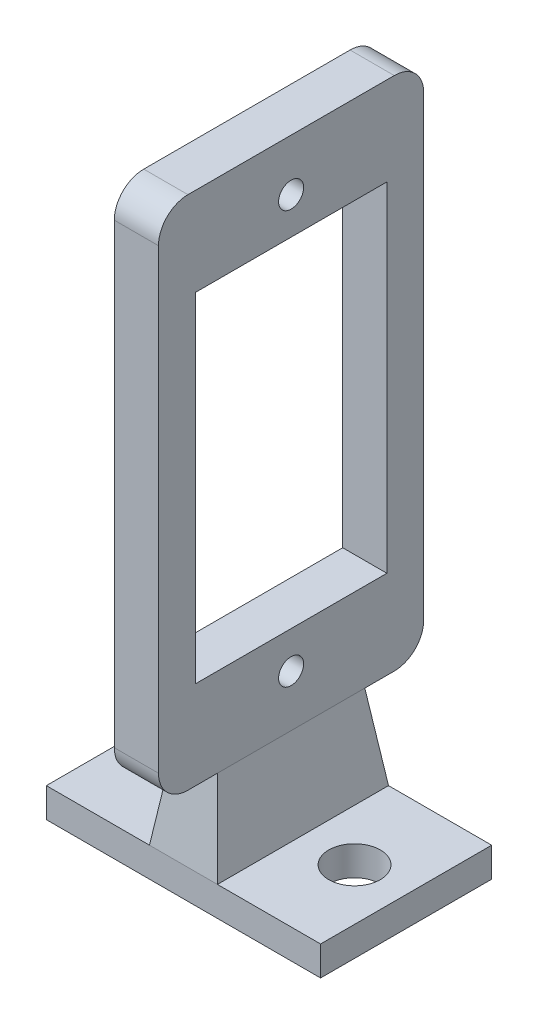
ISO-10303-21;
HEADER;
FILE_DESCRIPTION(('STEP AP214'),'2;1');
FILE_NAME('part.step','',(''),(''),'','','');
FILE_SCHEMA(('AUTOMOTIVE_DESIGN { 1 0 10303 214 1 1 1 1 }'));
ENDSEC;
DATA;
#1=APPLICATION_CONTEXT('core data for automotive mechanical design processes');
#2=APPLICATION_PROTOCOL_DEFINITION('international standard','automotive_design',2000,#1);
#3=PRODUCT_CONTEXT('',#1,'mechanical');
#4=PRODUCT('Part','Part','',(#3));
#5=PRODUCT_RELATED_PRODUCT_CATEGORY('part','',(#4));
#6=PRODUCT_DEFINITION_FORMATION('','',#4);
#7=PRODUCT_DEFINITION_CONTEXT('part definition',#1,'design');
#8=PRODUCT_DEFINITION('design','',#6,#7);
#9=PRODUCT_DEFINITION_SHAPE('','',#8);
#10=(LENGTH_UNIT() NAMED_UNIT(*) SI_UNIT(.MILLI.,.METRE.));
#11=(NAMED_UNIT(*) PLANE_ANGLE_UNIT() SI_UNIT($,.RADIAN.));
#12=(NAMED_UNIT(*) SI_UNIT($,.STERADIAN.) SOLID_ANGLE_UNIT());
#13=UNCERTAINTY_MEASURE_WITH_UNIT(LENGTH_MEASURE(1.E-05),#10,'distance_accuracy_value','');
#14=(GEOMETRIC_REPRESENTATION_CONTEXT(3) GLOBAL_UNCERTAINTY_ASSIGNED_CONTEXT((#13)) GLOBAL_UNIT_ASSIGNED_CONTEXT((#10,
#11,#12)) REPRESENTATION_CONTEXT('',''));
#15=CARTESIAN_POINT('',(0.,0.,0.));
#16=DIRECTION('',(0.,0.,1.));
#17=DIRECTION('',(1.,0.,0.));
#18=AXIS2_PLACEMENT_3D('',#15,#16,#17);
#19=CARTESIAN_POINT('',(1.5,-17.5,9.));
#20=DIRECTION('',(0.,1.,0.));
#21=DIRECTION('',(0.,0.,1.));
#22=AXIS2_PLACEMENT_3D('',#19,#20,#21);
#23=PLANE('',#22);
#24=DIRECTION('',(1.,0.,0.));
#25=VECTOR('',#24,1.);
#26=CARTESIAN_POINT('',(-1.5,-17.5,-5.));
#27=LINE('',#26,#25);
#28=CARTESIAN_POINT('',(-1.5,-17.5,-5.));
#29=VERTEX_POINT('',#28);
#30=CARTESIAN_POINT('',(1.5,-17.5,-5.));
#31=VERTEX_POINT('',#30);
#32=EDGE_CURVE('E200',#29,#31,#27,.T.);
#33=ORIENTED_EDGE('',*,*,#32,.F.);
#34=DIRECTION('',(0.,0.,-1.));
#35=VECTOR('',#34,1.);
#36=CARTESIAN_POINT('',(-1.5,-17.5,9.));
#37=LINE('',#36,#35);
#38=CARTESIAN_POINT('',(-1.5,-17.5,-7.));
#39=VERTEX_POINT('',#38);
#40=EDGE_CURVE('E302',#29,#39,#37,.T.);
#41=ORIENTED_EDGE('',*,*,#40,.T.);
#42=DIRECTION('',(-1.,0.,0.));
#43=VECTOR('',#42,1.);
#44=CARTESIAN_POINT('',(1.5,-17.5,-7.));
#45=LINE('',#44,#43);
#46=CARTESIAN_POINT('',(1.5,-17.5,-7.));
#47=VERTEX_POINT('',#46);
#48=EDGE_CURVE('E293',#39,#47,#45,.F.);
#49=ORIENTED_EDGE('',*,*,#48,.T.);
#50=DIRECTION('',(0.,0.,-1.));
#51=VECTOR('',#50,1.);
#52=CARTESIAN_POINT('',(1.5,-17.5,9.));
#53=LINE('',#52,#51);
#54=EDGE_CURVE('E47',#31,#47,#53,.T.);
#55=ORIENTED_EDGE('',*,*,#54,.F.);
#56=EDGE_LOOP('',(#33,#41,#49,#55));
#57=FACE_BOUND('',#56,.T.);
#58=ADVANCED_FACE('F32',(#57),#23,.F.);
#59=DIRECTION('',(-1.,0.,0.));
#60=VECTOR('',#59,1.);
#61=CARTESIAN_POINT('',(-1.5,-17.5,5.));
#62=LINE('',#61,#60);
#63=CARTESIAN_POINT('',(1.5,-17.5,5.));
#64=VERTEX_POINT('',#63);
#65=CARTESIAN_POINT('',(-1.5,-17.5,5.));
#66=VERTEX_POINT('',#65);
#67=EDGE_CURVE('E55',#64,#66,#62,.T.);
#68=ORIENTED_EDGE('',*,*,#67,.F.);
#69=CARTESIAN_POINT('',(1.5,-17.5,7.));
#70=VERTEX_POINT('',#69);
#71=EDGE_CURVE('E291',#70,#64,#53,.T.);
#72=ORIENTED_EDGE('',*,*,#71,.F.);
#73=DIRECTION('',(-1.,0.,0.));
#74=VECTOR('',#73,1.);
#75=CARTESIAN_POINT('',(1.5,-17.5,7.));
#76=LINE('',#75,#74);
#77=CARTESIAN_POINT('',(-1.5,-17.5,7.));
#78=VERTEX_POINT('',#77);
#79=EDGE_CURVE('E305',#70,#78,#76,.T.);
#80=ORIENTED_EDGE('',*,*,#79,.T.);
#81=EDGE_CURVE('E285',#78,#66,#37,.T.);
#82=ORIENTED_EDGE('',*,*,#81,.T.);
#83=EDGE_LOOP('',(#68,#72,#80,#82));
#84=FACE_BOUND('',#83,.T.);
#85=ADVANCED_FACE('F362',(#84),#23,.F.);
#86=CARTESIAN_POINT('',(1.5,-17.5,-9.));
#87=DIRECTION('',(0.,0.,1.));
#88=DIRECTION('',(1.,0.,0.));
#89=AXIS2_PLACEMENT_3D('',#86,#87,#88);
#90=PLANE('',#89);
#91=DIRECTION('',(0.,1.,0.));
#92=VECTOR('',#91,1.);
#93=CARTESIAN_POINT('',(1.5,-17.5,-9.));
#94=LINE('',#93,#92);
#95=CARTESIAN_POINT('',(1.5,-15.5,-9.));
#96=VERTEX_POINT('',#95);
#97=CARTESIAN_POINT('',(1.5,15.5,-9.));
#98=VERTEX_POINT('',#97);
#99=EDGE_CURVE('E281',#96,#98,#94,.T.);
#100=ORIENTED_EDGE('',*,*,#99,.F.);
#101=DIRECTION('',(-1.,0.,0.));
#102=VECTOR('',#101,1.);
#103=CARTESIAN_POINT('',(1.5,-15.5,-9.));
#104=LINE('',#103,#102);
#105=CARTESIAN_POINT('',(-1.5,-15.5,-9.));
#106=VERTEX_POINT('',#105);
#107=EDGE_CURVE('E332',#96,#106,#104,.T.);
#108=ORIENTED_EDGE('',*,*,#107,.T.);
#109=DIRECTION('',(0.,1.,0.));
#110=VECTOR('',#109,1.);
#111=CARTESIAN_POINT('',(-1.5,-17.5,-9.));
#112=LINE('',#111,#110);
#113=CARTESIAN_POINT('',(-1.5,15.5,-9.));
#114=VERTEX_POINT('',#113);
#115=EDGE_CURVE('E280',#106,#114,#112,.T.);
#116=ORIENTED_EDGE('',*,*,#115,.T.);
#117=DIRECTION('',(-1.,0.,0.));
#118=VECTOR('',#117,1.);
#119=CARTESIAN_POINT('',(1.5,15.5,-9.));
#120=LINE('',#119,#118);
#121=EDGE_CURVE('E330',#114,#98,#120,.F.);
#122=ORIENTED_EDGE('',*,*,#121,.T.);
#123=EDGE_LOOP('',(#100,#108,#116,#122));
#124=FACE_BOUND('',#123,.T.);
#125=ADVANCED_FACE('F418',(#124),#90,.F.);
#126=CARTESIAN_POINT('',(1.5,17.5,9.));
#127=DIRECTION('',(0.,-1.,0.));
#128=DIRECTION('',(0.,0.,-1.));
#129=AXIS2_PLACEMENT_3D('',#126,#127,#128);
#130=PLANE('',#129);
#131=DIRECTION('',(0.,0.,1.));
#132=VECTOR('',#131,1.);
#133=CARTESIAN_POINT('',(-1.5,17.5,9.));
#134=LINE('',#133,#132);
#135=CARTESIAN_POINT('',(-1.5,17.5,-7.));
#136=VERTEX_POINT('',#135);
#137=CARTESIAN_POINT('',(-1.5,17.5,7.));
#138=VERTEX_POINT('',#137);
#139=EDGE_CURVE('E296',#136,#138,#134,.T.);
#140=ORIENTED_EDGE('',*,*,#139,.T.);
#141=DIRECTION('',(-1.,0.,0.));
#142=VECTOR('',#141,1.);
#143=CARTESIAN_POINT('',(1.5,17.5,7.));
#144=LINE('',#143,#142);
#145=CARTESIAN_POINT('',(1.5,17.5,7.));
#146=VERTEX_POINT('',#145);
#147=EDGE_CURVE('E11',#138,#146,#144,.F.);
#148=ORIENTED_EDGE('',*,*,#147,.T.);
#149=DIRECTION('',(0.,0.,1.));
#150=VECTOR('',#149,1.);
#151=CARTESIAN_POINT('',(1.5,17.5,9.));
#152=LINE('',#151,#150);
#153=CARTESIAN_POINT('',(1.5,17.5,-7.));
#154=VERTEX_POINT('',#153);
#155=EDGE_CURVE('E284',#154,#146,#152,.T.);
#156=ORIENTED_EDGE('',*,*,#155,.F.);
#157=DIRECTION('',(-1.,0.,0.));
#158=VECTOR('',#157,1.);
#159=CARTESIAN_POINT('',(1.5,17.5,-7.));
#160=LINE('',#159,#158);
#161=EDGE_CURVE('E40',#154,#136,#160,.T.);
#162=ORIENTED_EDGE('',*,*,#161,.T.);
#163=EDGE_LOOP('',(#140,#148,#156,#162));
#164=FACE_BOUND('',#163,.T.);
#165=ADVANCED_FACE('F339',(#164),#130,.F.);
#166=CARTESIAN_POINT('',(1.5,-17.5,9.));
#167=DIRECTION('',(0.,0.,-1.));
#168=DIRECTION('',(-1.,0.,0.));
#169=AXIS2_PLACEMENT_3D('',#166,#167,#168);
#170=PLANE('',#169);
#171=DIRECTION('',(0.,-1.,0.));
#172=VECTOR('',#171,1.);
#173=CARTESIAN_POINT('',(-1.5,-17.5,9.));
#174=LINE('',#173,#172);
#175=CARTESIAN_POINT('',(-1.5,15.5,9.));
#176=VERTEX_POINT('',#175);
#177=CARTESIAN_POINT('',(-1.5,-15.5,9.));
#178=VERTEX_POINT('',#177);
#179=EDGE_CURVE('E299',#176,#178,#174,.T.);
#180=ORIENTED_EDGE('',*,*,#179,.T.);
#181=DIRECTION('',(-1.,0.,0.));
#182=VECTOR('',#181,1.);
#183=CARTESIAN_POINT('',(1.5,-15.5,9.));
#184=LINE('',#183,#182);
#185=CARTESIAN_POINT('',(1.5,-15.5,9.));
#186=VERTEX_POINT('',#185);
#187=EDGE_CURVE('E320',#178,#186,#184,.F.);
#188=ORIENTED_EDGE('',*,*,#187,.T.);
#189=DIRECTION('',(0.,-1.,0.));
#190=VECTOR('',#189,1.);
#191=CARTESIAN_POINT('',(1.5,-17.5,9.));
#192=LINE('',#191,#190);
#193=CARTESIAN_POINT('',(1.5,15.5,9.));
#194=VERTEX_POINT('',#193);
#195=EDGE_CURVE('E288',#194,#186,#192,.T.);
#196=ORIENTED_EDGE('',*,*,#195,.F.);
#197=DIRECTION('',(-1.,0.,0.));
#198=VECTOR('',#197,1.);
#199=CARTESIAN_POINT('',(1.5,15.5,9.));
#200=LINE('',#199,#198);
#201=EDGE_CURVE('E317',#194,#176,#200,.T.);
#202=ORIENTED_EDGE('',*,*,#201,.T.);
#203=EDGE_LOOP('',(#180,#188,#196,#202));
#204=FACE_BOUND('',#203,.T.);
#205=ADVANCED_FACE('F354',(#204),#170,.F.);
#206=CARTESIAN_POINT('',(1.5,0.,0.));
#207=DIRECTION('',(-1.,0.,0.));
#208=DIRECTION('',(0.,0.,1.));
#209=AXIS2_PLACEMENT_3D('',#206,#207,#208);
#210=PLANE('',#209);
#211=CARTESIAN_POINT('',(1.5,-14.,0.));
#212=DIRECTION('',(-1.,0.,0.));
#213=DIRECTION('',(0.,0.,1.));
#214=AXIS2_PLACEMENT_3D('',#211,#212,#213);
#215=CIRCLE('',#214,0.85);
#216=CARTESIAN_POINT('',(1.5,-14.,0.85));
#217=VERTEX_POINT('',#216);
#218=EDGE_CURVE('E239',#217,#217,#215,.F.);
#219=ORIENTED_EDGE('',*,*,#218,.F.);
#220=EDGE_LOOP('',(#219));
#221=FACE_BOUND('',#220,.T.);
#222=CARTESIAN_POINT('',(1.5,14.,0.));
#223=DIRECTION('',(-1.,0.,0.));
#224=DIRECTION('',(0.,0.,1.));
#225=AXIS2_PLACEMENT_3D('',#222,#223,#224);
#226=CIRCLE('',#225,0.85);
#227=CARTESIAN_POINT('',(1.5,14.,0.85));
#228=VERTEX_POINT('',#227);
#229=EDGE_CURVE('E245',#228,#228,#226,.F.);
#230=ORIENTED_EDGE('',*,*,#229,.F.);
#231=EDGE_LOOP('',(#230));
#232=FACE_BOUND('',#231,.T.);
#233=DIRECTION('',(0.,0.,-1.));
#234=VECTOR('',#233,1.);
#235=CARTESIAN_POINT('',(1.5,-11.5,-6.5));
#236=LINE('',#235,#234);
#237=CARTESIAN_POINT('',(1.5,-11.5,6.5));
#238=VERTEX_POINT('',#237);
#239=CARTESIAN_POINT('',(1.5,-11.5,-6.5));
#240=VERTEX_POINT('',#239);
#241=EDGE_CURVE('E259',#238,#240,#236,.T.);
#242=ORIENTED_EDGE('',*,*,#241,.F.);
#243=DIRECTION('',(0.,-1.,0.));
#244=VECTOR('',#243,1.);
#245=CARTESIAN_POINT('',(1.5,-11.5,6.5));
#246=LINE('',#245,#244);
#247=CARTESIAN_POINT('',(1.5,11.5,6.5));
#248=VERTEX_POINT('',#247);
#249=EDGE_CURVE('E257',#248,#238,#246,.T.);
#250=ORIENTED_EDGE('',*,*,#249,.F.);
#251=DIRECTION('',(0.,0.,1.));
#252=VECTOR('',#251,1.);
#253=CARTESIAN_POINT('',(1.5,11.5,-6.5));
#254=LINE('',#253,#252);
#255=CARTESIAN_POINT('',(1.5,11.5,-6.5));
#256=VERTEX_POINT('',#255);
#257=EDGE_CURVE('E265',#256,#248,#254,.T.);
#258=ORIENTED_EDGE('',*,*,#257,.F.);
#259=DIRECTION('',(0.,1.,0.));
#260=VECTOR('',#259,1.);
#261=CARTESIAN_POINT('',(1.5,-11.5,-6.5));
#262=LINE('',#261,#260);
#263=EDGE_CURVE('E262',#240,#256,#262,.T.);
#264=ORIENTED_EDGE('',*,*,#263,.F.);
#265=EDGE_LOOP('',(#242,#250,#258,#264));
#266=FACE_BOUND('',#265,.T.);
#267=ORIENTED_EDGE('',*,*,#195,.T.);
#268=CARTESIAN_POINT('',(1.5,-15.5,7.));
#269=DIRECTION('',(-1.,0.,0.));
#270=DIRECTION('',(0.,0.,1.));
#271=AXIS2_PLACEMENT_3D('',#268,#269,#270);
#272=CIRCLE('',#271,2.);
#273=EDGE_CURVE('E328',#186,#70,#272,.F.);
#274=ORIENTED_EDGE('',*,*,#273,.T.);
#275=ORIENTED_EDGE('',*,*,#71,.T.);
#276=DIRECTION('',(0.,0.,1.));
#277=VECTOR('',#276,1.);
#278=CARTESIAN_POINT('',(1.5,-17.5,-5.));
#279=LINE('',#278,#277);
#280=EDGE_CURVE('E208',#31,#64,#279,.T.);
#281=ORIENTED_EDGE('',*,*,#280,.F.);
#282=ORIENTED_EDGE('',*,*,#54,.T.);
#283=CARTESIAN_POINT('',(1.5,-15.5,-7.));
#284=DIRECTION('',(-1.,0.,0.));
#285=DIRECTION('',(0.,0.,1.));
#286=AXIS2_PLACEMENT_3D('',#283,#284,#285);
#287=CIRCLE('',#286,2.);
#288=EDGE_CURVE('E326',#47,#96,#287,.F.);
#289=ORIENTED_EDGE('',*,*,#288,.T.);
#290=ORIENTED_EDGE('',*,*,#99,.T.);
#291=CARTESIAN_POINT('',(1.5,15.5,-7.));
#292=DIRECTION('',(-1.,0.,0.));
#293=DIRECTION('',(0.,0.,1.));
#294=AXIS2_PLACEMENT_3D('',#291,#292,#293);
#295=CIRCLE('',#294,2.);
#296=EDGE_CURVE('E322',#98,#154,#295,.F.);
#297=ORIENTED_EDGE('',*,*,#296,.T.);
#298=ORIENTED_EDGE('',*,*,#155,.T.);
#299=CARTESIAN_POINT('',(1.5,15.5,7.));
#300=DIRECTION('',(-1.,0.,0.));
#301=DIRECTION('',(0.,0.,1.));
#302=AXIS2_PLACEMENT_3D('',#299,#300,#301);
#303=CIRCLE('',#302,2.);
#304=EDGE_CURVE('E324',#146,#194,#303,.F.);
#305=ORIENTED_EDGE('',*,*,#304,.T.);
#306=EDGE_LOOP('',(#267,#274,#275,#281,#282,#289,#290,#297,#298,#305));
#307=FACE_BOUND('',#306,.T.);
#308=ADVANCED_FACE('F358',(#221,#232,#266,#307),#210,.F.);
#309=CARTESIAN_POINT('',(-1.5,0.,0.));
#310=DIRECTION('',(-1.,0.,0.));
#311=DIRECTION('',(0.,0.,1.));
#312=AXIS2_PLACEMENT_3D('',#309,#310,#311);
#313=PLANE('',#312);
#314=CARTESIAN_POINT('',(-1.5,-14.,0.));
#315=DIRECTION('',(-1.,0.,0.));
#316=DIRECTION('',(0.,0.,1.));
#317=AXIS2_PLACEMENT_3D('',#314,#315,#316);
#318=CIRCLE('',#317,0.85);
#319=CARTESIAN_POINT('',(-1.5,-14.,0.85));
#320=VERTEX_POINT('',#319);
#321=EDGE_CURVE('E216',#320,#320,#318,.T.);
#322=ORIENTED_EDGE('',*,*,#321,.F.);
#323=EDGE_LOOP('',(#322));
#324=FACE_BOUND('',#323,.T.);
#325=CARTESIAN_POINT('',(-1.5,14.,0.));
#326=DIRECTION('',(-1.,0.,0.));
#327=DIRECTION('',(0.,0.,1.));
#328=AXIS2_PLACEMENT_3D('',#325,#326,#327);
#329=CIRCLE('',#328,0.85);
#330=CARTESIAN_POINT('',(-1.5,14.,0.85));
#331=VERTEX_POINT('',#330);
#332=EDGE_CURVE('E242',#331,#331,#329,.T.);
#333=ORIENTED_EDGE('',*,*,#332,.F.);
#334=EDGE_LOOP('',(#333));
#335=FACE_BOUND('',#334,.T.);
#336=DIRECTION('',(0.,-1.,0.));
#337=VECTOR('',#336,1.);
#338=CARTESIAN_POINT('',(-1.5,-11.5,6.5));
#339=LINE('',#338,#337);
#340=CARTESIAN_POINT('',(-1.5,11.5,6.5));
#341=VERTEX_POINT('',#340);
#342=CARTESIAN_POINT('',(-1.5,-11.5,6.5));
#343=VERTEX_POINT('',#342);
#344=EDGE_CURVE('E254',#341,#343,#339,.T.);
#345=ORIENTED_EDGE('',*,*,#344,.T.);
#346=DIRECTION('',(0.,0.,-1.));
#347=VECTOR('',#346,1.);
#348=CARTESIAN_POINT('',(-1.5,-11.5,-6.5));
#349=LINE('',#348,#347);
#350=CARTESIAN_POINT('',(-1.5,-11.5,-6.5));
#351=VERTEX_POINT('',#350);
#352=EDGE_CURVE('E271',#343,#351,#349,.T.);
#353=ORIENTED_EDGE('',*,*,#352,.T.);
#354=DIRECTION('',(0.,1.,0.));
#355=VECTOR('',#354,1.);
#356=CARTESIAN_POINT('',(-1.5,-11.5,-6.5));
#357=LINE('',#356,#355);
#358=CARTESIAN_POINT('',(-1.5,11.5,-6.5));
#359=VERTEX_POINT('',#358);
#360=EDGE_CURVE('E248',#351,#359,#357,.T.);
#361=ORIENTED_EDGE('',*,*,#360,.T.);
#362=DIRECTION('',(0.,0.,1.));
#363=VECTOR('',#362,1.);
#364=CARTESIAN_POINT('',(-1.5,11.5,-6.5));
#365=LINE('',#364,#363);
#366=EDGE_CURVE('E251',#359,#341,#365,.T.);
#367=ORIENTED_EDGE('',*,*,#366,.T.);
#368=EDGE_LOOP('',(#345,#353,#361,#367));
#369=FACE_BOUND('',#368,.T.);
#370=ORIENTED_EDGE('',*,*,#81,.F.);
#371=CARTESIAN_POINT('',(-1.5,-15.5,7.));
#372=DIRECTION('',(-1.,0.,0.));
#373=DIRECTION('',(0.,0.,1.));
#374=AXIS2_PLACEMENT_3D('',#371,#372,#373);
#375=CIRCLE('',#374,2.);
#376=EDGE_CURVE('E315',#78,#178,#375,.T.);
#377=ORIENTED_EDGE('',*,*,#376,.T.);
#378=ORIENTED_EDGE('',*,*,#179,.F.);
#379=CARTESIAN_POINT('',(-1.5,15.5,7.));
#380=DIRECTION('',(-1.,0.,0.));
#381=DIRECTION('',(0.,0.,1.));
#382=AXIS2_PLACEMENT_3D('',#379,#380,#381);
#383=CIRCLE('',#382,2.);
#384=EDGE_CURVE('E310',#176,#138,#383,.T.);
#385=ORIENTED_EDGE('',*,*,#384,.T.);
#386=ORIENTED_EDGE('',*,*,#139,.F.);
#387=CARTESIAN_POINT('',(-1.5,15.5,-7.));
#388=DIRECTION('',(-1.,0.,0.));
#389=DIRECTION('',(0.,0.,1.));
#390=AXIS2_PLACEMENT_3D('',#387,#388,#389);
#391=CIRCLE('',#390,2.);
#392=EDGE_CURVE('E308',#136,#114,#391,.T.);
#393=ORIENTED_EDGE('',*,*,#392,.T.);
#394=ORIENTED_EDGE('',*,*,#115,.F.);
#395=CARTESIAN_POINT('',(-1.5,-15.5,-7.));
#396=DIRECTION('',(-1.,0.,0.));
#397=DIRECTION('',(0.,0.,1.));
#398=AXIS2_PLACEMENT_3D('',#395,#396,#397);
#399=CIRCLE('',#398,2.);
#400=EDGE_CURVE('E312',#106,#39,#399,.T.);
#401=ORIENTED_EDGE('',*,*,#400,.T.);
#402=ORIENTED_EDGE('',*,*,#40,.F.);
#403=DIRECTION('',(0.,0.,-1.));
#404=VECTOR('',#403,1.);
#405=CARTESIAN_POINT('',(-1.5,-17.5,-5.));
#406=LINE('',#405,#404);
#407=EDGE_CURVE('E197',#66,#29,#406,.T.);
#408=ORIENTED_EDGE('',*,*,#407,.F.);
#409=EDGE_LOOP('',(#370,#377,#378,#385,#386,#393,#394,#401,#402,#408));
#410=FACE_BOUND('',#409,.T.);
#411=ADVANCED_FACE('F345',(#324,#335,#369,#410),#313,.T.);
#412=CARTESIAN_POINT('',(-1.501,-11.5,6.5));
#413=DIRECTION('',(0.,0.,1.));
#414=DIRECTION('',(1.,0.,0.));
#415=AXIS2_PLACEMENT_3D('',#412,#413,#414);
#416=PLANE('',#415);
#417=DIRECTION('',(1.,0.,0.));
#418=VECTOR('',#417,1.);
#419=CARTESIAN_POINT('',(-1.501,11.5,6.5));
#420=LINE('',#419,#418);
#421=EDGE_CURVE('E269',#341,#248,#420,.T.);
#422=ORIENTED_EDGE('',*,*,#421,.T.);
#423=ORIENTED_EDGE('',*,*,#249,.T.);
#424=DIRECTION('',(1.,0.,0.));
#425=VECTOR('',#424,1.);
#426=CARTESIAN_POINT('',(-1.501,-11.5,6.5));
#427=LINE('',#426,#425);
#428=EDGE_CURVE('E268',#343,#238,#427,.T.);
#429=ORIENTED_EDGE('',*,*,#428,.F.);
#430=ORIENTED_EDGE('',*,*,#344,.F.);
#431=EDGE_LOOP('',(#422,#423,#429,#430));
#432=FACE_BOUND('',#431,.T.);
#433=ADVANCED_FACE('F469',(#432),#416,.F.);
#434=CARTESIAN_POINT('',(-1.501,11.5,-6.5));
#435=DIRECTION('',(0.,1.,0.));
#436=DIRECTION('',(0.,0.,1.));
#437=AXIS2_PLACEMENT_3D('',#434,#435,#436);
#438=PLANE('',#437);
#439=DIRECTION('',(1.,0.,0.));
#440=VECTOR('',#439,1.);
#441=CARTESIAN_POINT('',(-1.501,11.5,-6.5));
#442=LINE('',#441,#440);
#443=EDGE_CURVE('E272',#359,#256,#442,.T.);
#444=ORIENTED_EDGE('',*,*,#443,.T.);
#445=ORIENTED_EDGE('',*,*,#257,.T.);
#446=ORIENTED_EDGE('',*,*,#421,.F.);
#447=ORIENTED_EDGE('',*,*,#366,.F.);
#448=EDGE_LOOP('',(#444,#445,#446,#447));
#449=FACE_BOUND('',#448,.T.);
#450=ADVANCED_FACE('F465',(#449),#438,.F.);
#451=CARTESIAN_POINT('',(-1.501,-11.5,-6.5));
#452=DIRECTION('',(0.,0.,-1.));
#453=DIRECTION('',(-1.,0.,0.));
#454=AXIS2_PLACEMENT_3D('',#451,#452,#453);
#455=PLANE('',#454);
#456=DIRECTION('',(1.,0.,0.));
#457=VECTOR('',#456,1.);
#458=CARTESIAN_POINT('',(-1.501,-11.5,-6.5));
#459=LINE('',#458,#457);
#460=EDGE_CURVE('E274',#351,#240,#459,.T.);
#461=ORIENTED_EDGE('',*,*,#460,.T.);
#462=ORIENTED_EDGE('',*,*,#263,.T.);
#463=ORIENTED_EDGE('',*,*,#443,.F.);
#464=ORIENTED_EDGE('',*,*,#360,.F.);
#465=EDGE_LOOP('',(#461,#462,#463,#464));
#466=FACE_BOUND('',#465,.T.);
#467=ADVANCED_FACE('F468',(#466),#455,.F.);
#468=CARTESIAN_POINT('',(-1.501,-11.5,-6.5));
#469=DIRECTION('',(0.,-1.,0.));
#470=DIRECTION('',(0.,0.,-1.));
#471=AXIS2_PLACEMENT_3D('',#468,#469,#470);
#472=PLANE('',#471);
#473=ORIENTED_EDGE('',*,*,#428,.T.);
#474=ORIENTED_EDGE('',*,*,#241,.T.);
#475=ORIENTED_EDGE('',*,*,#460,.F.);
#476=ORIENTED_EDGE('',*,*,#352,.F.);
#477=EDGE_LOOP('',(#473,#474,#475,#476));
#478=FACE_BOUND('',#477,.T.);
#479=ADVANCED_FACE('F463',(#478),#472,.F.);
#480=CARTESIAN_POINT('',(1.501,14.,0.));
#481=DIRECTION('',(-1.,0.,0.));
#482=DIRECTION('',(0.,0.,1.));
#483=AXIS2_PLACEMENT_3D('',#480,#481,#482);
#484=CYLINDRICAL_SURFACE('',#483,0.85);
#485=CARTESIAN_POINT('',(-1.5,14.,0.85));
#486=CARTESIAN_POINT('',(-1.46875,14.,0.85));
#487=CARTESIAN_POINT('',(-1.4375,14.,0.85));
#488=CARTESIAN_POINT('',(-1.375,14.,0.85));
#489=CARTESIAN_POINT('',(-1.34375,14.,0.85));
#490=CARTESIAN_POINT('',(-1.28125,14.,0.85));
#491=CARTESIAN_POINT('',(-1.25,14.,0.85));
#492=CARTESIAN_POINT('',(-1.1875,14.,0.85));
#493=CARTESIAN_POINT('',(-1.15625,14.,0.85));
#494=CARTESIAN_POINT('',(-1.09375,14.,0.85));
#495=CARTESIAN_POINT('',(-1.0625,14.,0.85));
#496=CARTESIAN_POINT('',(-1.,14.,0.85));
#497=CARTESIAN_POINT('',(-0.96875,14.,0.85));
#498=CARTESIAN_POINT('',(-0.90625,14.,0.85));
#499=CARTESIAN_POINT('',(-0.874999999999999,14.,0.85));
#500=CARTESIAN_POINT('',(-0.8125,14.,0.85));
#501=CARTESIAN_POINT('',(-0.78125,14.,0.85));
#502=CARTESIAN_POINT('',(-0.71875,14.,0.85));
#503=CARTESIAN_POINT('',(-0.6875,14.,0.85));
#504=CARTESIAN_POINT('',(-0.625,14.,0.85));
#505=CARTESIAN_POINT('',(-0.59375,14.,0.85));
#506=CARTESIAN_POINT('',(-0.53125,14.,0.85));
#507=CARTESIAN_POINT('',(-0.5,14.,0.85));
#508=CARTESIAN_POINT('',(-0.4375,14.,0.85));
#509=CARTESIAN_POINT('',(-0.40625,14.,0.85));
#510=CARTESIAN_POINT('',(-0.34375,14.,0.85));
#511=CARTESIAN_POINT('',(-0.3125,14.,0.85));
#512=CARTESIAN_POINT('',(-0.25,14.,0.85));
#513=CARTESIAN_POINT('',(-0.21875,14.,0.85));
#514=CARTESIAN_POINT('',(-0.15625,14.,0.85));
#515=CARTESIAN_POINT('',(-0.125,14.,0.85));
#516=CARTESIAN_POINT('',(-0.0624999999999998,14.,0.85));
#517=CARTESIAN_POINT('',(-0.0312499999999998,14.,0.85));
#518=CARTESIAN_POINT('',(0.0312500000000002,14.,0.85));
#519=CARTESIAN_POINT('',(0.0625000000000003,14.,0.85));
#520=CARTESIAN_POINT('',(0.125,14.,0.85));
#521=CARTESIAN_POINT('',(0.15625,14.,0.85));
#522=CARTESIAN_POINT('',(0.21875,14.,0.85));
#523=CARTESIAN_POINT('',(0.25,14.,0.85));
#524=CARTESIAN_POINT('',(0.3125,14.,0.85));
#525=CARTESIAN_POINT('',(0.34375,14.,0.85));
#526=CARTESIAN_POINT('',(0.40625,14.,0.85));
#527=CARTESIAN_POINT('',(0.4375,14.,0.85));
#528=CARTESIAN_POINT('',(0.5,14.,0.85));
#529=CARTESIAN_POINT('',(0.53125,14.,0.85));
#530=CARTESIAN_POINT('',(0.59375,14.,0.85));
#531=CARTESIAN_POINT('',(0.625,14.,0.85));
#532=CARTESIAN_POINT('',(0.6875,14.,0.85));
#533=CARTESIAN_POINT('',(0.71875,14.,0.85));
#534=CARTESIAN_POINT('',(0.78125,14.,0.85));
#535=CARTESIAN_POINT('',(0.8125,14.,0.85));
#536=CARTESIAN_POINT('',(0.875,14.,0.85));
#537=CARTESIAN_POINT('',(0.90625,14.,0.85));
#538=CARTESIAN_POINT('',(0.96875,14.,0.85));
#539=CARTESIAN_POINT('',(1.,14.,0.85));
#540=CARTESIAN_POINT('',(1.0625,14.,0.85));
#541=CARTESIAN_POINT('',(1.09375,14.,0.85));
#542=CARTESIAN_POINT('',(1.15625,14.,0.85));
#543=CARTESIAN_POINT('',(1.1875,14.,0.85));
#544=CARTESIAN_POINT('',(1.25,14.,0.85));
#545=CARTESIAN_POINT('',(1.28125,14.,0.85));
#546=CARTESIAN_POINT('',(1.34375,14.,0.85));
#547=CARTESIAN_POINT('',(1.375,14.,0.85));
#548=CARTESIAN_POINT('',(1.4375,14.,0.85));
#549=CARTESIAN_POINT('',(1.46875,14.,0.85));
#550=CARTESIAN_POINT('',(1.5,14.,0.85));
#551=B_SPLINE_CURVE_WITH_KNOTS('',3,(#485,#486,#487,#488,#489,#490,#491,#492,#493,#494,#495,
#496,#497,#498,#499,#500,#501,#502,#503,#504,#505,#506,#507,#508,#509,#510,#511,#512,#513,#514,
#515,#516,#517,#518,#519,#520,#521,#522,#523,#524,#525,#526,#527,#528,#529,#530,#531,#532,#533,
#534,#535,#536,#537,#538,#539,#540,#541,#542,#543,#544,#545,#546,#547,#548,#549,#550),
.UNSPECIFIED.,.F.,.F.,(4,2,2,2,2,2,2,2,2,2,2,2,2,2,2,2,2,2,2,2,2,2,2,2,2,2,2,2,2,2,2,2,4),(0.,
0.0937500000000001,0.1875,0.28125,0.375,0.46875,0.5625,0.65625,0.75,0.84375,0.9375,1.03125,
1.125,1.21875,1.3125,1.40625,1.5,1.59375,1.6875,1.78125,1.875,1.96875,2.0625,2.15625,2.25,
2.34375,2.4375,2.53125,2.625,2.71875,2.8125,2.90625,3.),.UNSPECIFIED.);
#552=EDGE_CURVE('BSEAM459',#331,#228,#551,.T.);
#553=ORIENTED_EDGE('',*,*,#332,.T.);
#554=ORIENTED_EDGE('',*,*,#229,.T.);
#555=ORIENTED_EDGE('',*,*,#552,.T.);
#556=ORIENTED_EDGE('',*,*,#552,.F.);
#557=EDGE_LOOP('',(#553,#555,#554,#556));
#558=FACE_BOUND('',#557,.T.);
#559=ADVANCED_FACE('F459',(#558),#484,.F.);
#560=CARTESIAN_POINT('',(1.501,-14.,0.));
#561=DIRECTION('',(-1.,0.,0.));
#562=DIRECTION('',(0.,0.,1.));
#563=AXIS2_PLACEMENT_3D('',#560,#561,#562);
#564=CYLINDRICAL_SURFACE('',#563,0.85);
#565=CARTESIAN_POINT('',(-1.5,-14.,0.85));
#566=CARTESIAN_POINT('',(-1.46875,-14.,0.85));
#567=CARTESIAN_POINT('',(-1.4375,-14.,0.85));
#568=CARTESIAN_POINT('',(-1.375,-14.,0.85));
#569=CARTESIAN_POINT('',(-1.34375,-14.,0.85));
#570=CARTESIAN_POINT('',(-1.28125,-14.,0.85));
#571=CARTESIAN_POINT('',(-1.25,-14.,0.85));
#572=CARTESIAN_POINT('',(-1.1875,-14.,0.85));
#573=CARTESIAN_POINT('',(-1.15625,-14.,0.85));
#574=CARTESIAN_POINT('',(-1.09375,-14.,0.85));
#575=CARTESIAN_POINT('',(-1.0625,-14.,0.85));
#576=CARTESIAN_POINT('',(-1.,-14.,0.85));
#577=CARTESIAN_POINT('',(-0.96875,-14.,0.85));
#578=CARTESIAN_POINT('',(-0.90625,-14.,0.85));
#579=CARTESIAN_POINT('',(-0.874999999999999,-14.,0.85));
#580=CARTESIAN_POINT('',(-0.8125,-14.,0.85));
#581=CARTESIAN_POINT('',(-0.78125,-14.,0.85));
#582=CARTESIAN_POINT('',(-0.71875,-14.,0.85));
#583=CARTESIAN_POINT('',(-0.6875,-14.,0.85));
#584=CARTESIAN_POINT('',(-0.625,-14.,0.85));
#585=CARTESIAN_POINT('',(-0.59375,-14.,0.85));
#586=CARTESIAN_POINT('',(-0.53125,-14.,0.85));
#587=CARTESIAN_POINT('',(-0.5,-14.,0.85));
#588=CARTESIAN_POINT('',(-0.4375,-14.,0.85));
#589=CARTESIAN_POINT('',(-0.40625,-14.,0.85));
#590=CARTESIAN_POINT('',(-0.34375,-14.,0.85));
#591=CARTESIAN_POINT('',(-0.3125,-14.,0.85));
#592=CARTESIAN_POINT('',(-0.25,-14.,0.85));
#593=CARTESIAN_POINT('',(-0.21875,-14.,0.85));
#594=CARTESIAN_POINT('',(-0.15625,-14.,0.85));
#595=CARTESIAN_POINT('',(-0.125,-14.,0.85));
#596=CARTESIAN_POINT('',(-0.0624999999999998,-14.,0.85));
#597=CARTESIAN_POINT('',(-0.0312499999999998,-14.,0.85));
#598=CARTESIAN_POINT('',(0.0312500000000002,-14.,0.85));
#599=CARTESIAN_POINT('',(0.0625000000000003,-14.,0.85));
#600=CARTESIAN_POINT('',(0.125,-14.,0.85));
#601=CARTESIAN_POINT('',(0.15625,-14.,0.85));
#602=CARTESIAN_POINT('',(0.21875,-14.,0.85));
#603=CARTESIAN_POINT('',(0.25,-14.,0.85));
#604=CARTESIAN_POINT('',(0.3125,-14.,0.85));
#605=CARTESIAN_POINT('',(0.34375,-14.,0.85));
#606=CARTESIAN_POINT('',(0.40625,-14.,0.85));
#607=CARTESIAN_POINT('',(0.4375,-14.,0.85));
#608=CARTESIAN_POINT('',(0.5,-14.,0.85));
#609=CARTESIAN_POINT('',(0.53125,-14.,0.85));
#610=CARTESIAN_POINT('',(0.59375,-14.,0.85));
#611=CARTESIAN_POINT('',(0.625,-14.,0.85));
#612=CARTESIAN_POINT('',(0.6875,-14.,0.85));
#613=CARTESIAN_POINT('',(0.71875,-14.,0.85));
#614=CARTESIAN_POINT('',(0.78125,-14.,0.85));
#615=CARTESIAN_POINT('',(0.8125,-14.,0.85));
#616=CARTESIAN_POINT('',(0.875,-14.,0.85));
#617=CARTESIAN_POINT('',(0.90625,-14.,0.85));
#618=CARTESIAN_POINT('',(0.96875,-14.,0.85));
#619=CARTESIAN_POINT('',(1.,-14.,0.85));
#620=CARTESIAN_POINT('',(1.0625,-14.,0.85));
#621=CARTESIAN_POINT('',(1.09375,-14.,0.85));
#622=CARTESIAN_POINT('',(1.15625,-14.,0.85));
#623=CARTESIAN_POINT('',(1.1875,-14.,0.85));
#624=CARTESIAN_POINT('',(1.25,-14.,0.85));
#625=CARTESIAN_POINT('',(1.28125,-14.,0.85));
#626=CARTESIAN_POINT('',(1.34375,-14.,0.85));
#627=CARTESIAN_POINT('',(1.375,-14.,0.85));
#628=CARTESIAN_POINT('',(1.4375,-14.,0.85));
#629=CARTESIAN_POINT('',(1.46875,-14.,0.85));
#630=CARTESIAN_POINT('',(1.5,-14.,0.85));
#631=B_SPLINE_CURVE_WITH_KNOTS('',3,(#565,#566,#567,#568,#569,#570,#571,#572,#573,#574,#575,
#576,#577,#578,#579,#580,#581,#582,#583,#584,#585,#586,#587,#588,#589,#590,#591,#592,#593,#594,
#595,#596,#597,#598,#599,#600,#601,#602,#603,#604,#605,#606,#607,#608,#609,#610,#611,#612,#613,
#614,#615,#616,#617,#618,#619,#620,#621,#622,#623,#624,#625,#626,#627,#628,#629,#630),
.UNSPECIFIED.,.F.,.F.,(4,2,2,2,2,2,2,2,2,2,2,2,2,2,2,2,2,2,2,2,2,2,2,2,2,2,2,2,2,2,2,2,4),(0.,
0.0937500000000001,0.1875,0.28125,0.375,0.46875,0.5625,0.65625,0.75,0.84375,0.9375,1.03125,
1.125,1.21875,1.3125,1.40625,1.5,1.59375,1.6875,1.78125,1.875,1.96875,2.0625,2.15625,2.25,
2.34375,2.4375,2.53125,2.625,2.71875,2.8125,2.90625,3.),.UNSPECIFIED.);
#632=EDGE_CURVE('BSEAM432',#320,#217,#631,.T.);
#633=ORIENTED_EDGE('',*,*,#321,.T.);
#634=ORIENTED_EDGE('',*,*,#218,.T.);
#635=ORIENTED_EDGE('',*,*,#632,.T.);
#636=ORIENTED_EDGE('',*,*,#632,.F.);
#637=EDGE_LOOP('',(#633,#635,#634,#636));
#638=FACE_BOUND('',#637,.T.);
#639=ADVANCED_FACE('F432',(#638),#564,.F.);
#640=CARTESIAN_POINT('',(1.5,-15.5,7.));
#641=DIRECTION('',(-1.,0.,0.));
#642=DIRECTION('',(0.,0.,1.));
#643=AXIS2_PLACEMENT_3D('',#640,#641,#642);
#644=CYLINDRICAL_SURFACE('',#643,2.);
#645=ORIENTED_EDGE('',*,*,#273,.F.);
#646=ORIENTED_EDGE('',*,*,#187,.F.);
#647=ORIENTED_EDGE('',*,*,#376,.F.);
#648=ORIENTED_EDGE('',*,*,#79,.F.);
#649=EDGE_LOOP('',(#645,#646,#647,#648));
#650=FACE_BOUND('',#649,.T.);
#651=ADVANCED_FACE('F361',(#650),#644,.T.);
#652=CARTESIAN_POINT('',(1.5,-15.5,-7.));
#653=DIRECTION('',(-1.,0.,0.));
#654=DIRECTION('',(0.,0.,1.));
#655=AXIS2_PLACEMENT_3D('',#652,#653,#654);
#656=CYLINDRICAL_SURFACE('',#655,2.);
#657=ORIENTED_EDGE('',*,*,#288,.F.);
#658=ORIENTED_EDGE('',*,*,#48,.F.);
#659=ORIENTED_EDGE('',*,*,#400,.F.);
#660=ORIENTED_EDGE('',*,*,#107,.F.);
#661=EDGE_LOOP('',(#657,#658,#659,#660));
#662=FACE_BOUND('',#661,.T.);
#663=ADVANCED_FACE('F431',(#662),#656,.T.);
#664=CARTESIAN_POINT('',(1.5,15.5,7.));
#665=DIRECTION('',(-1.,0.,0.));
#666=DIRECTION('',(0.,0.,1.));
#667=AXIS2_PLACEMENT_3D('',#664,#665,#666);
#668=CYLINDRICAL_SURFACE('',#667,2.);
#669=ORIENTED_EDGE('',*,*,#304,.F.);
#670=ORIENTED_EDGE('',*,*,#147,.F.);
#671=ORIENTED_EDGE('',*,*,#384,.F.);
#672=ORIENTED_EDGE('',*,*,#201,.F.);
#673=EDGE_LOOP('',(#669,#670,#671,#672));
#674=FACE_BOUND('',#673,.T.);
#675=ADVANCED_FACE('F351',(#674),#668,.T.);
#676=CARTESIAN_POINT('',(1.5,15.5,-7.));
#677=DIRECTION('',(-1.,0.,0.));
#678=DIRECTION('',(0.,0.,1.));
#679=AXIS2_PLACEMENT_3D('',#676,#677,#678);
#680=CYLINDRICAL_SURFACE('',#679,2.);
#681=ORIENTED_EDGE('',*,*,#296,.F.);
#682=ORIENTED_EDGE('',*,*,#121,.F.);
#683=ORIENTED_EDGE('',*,*,#392,.F.);
#684=ORIENTED_EDGE('',*,*,#161,.F.);
#685=EDGE_LOOP('',(#681,#682,#683,#684));
#686=FACE_BOUND('',#685,.T.);
#687=ADVANCED_FACE('F34',(#686),#680,.T.);
#688=CARTESIAN_POINT('',(-1.5,-17.5,-5.));
#689=DIRECTION('',(-0.99026806874157,0.139173100960066,0.));
#690=DIRECTION('',(-0.139173100960066,-0.99026806874157,0.));
#691=AXIS2_PLACEMENT_3D('',#688,#689,#690);
#692=PLANE('',#691);
#693=ORIENTED_EDGE('',*,*,#407,.T.);
#694=DIRECTION('',(0.137844537491629,0.980814848463989,0.137844537491629));
#695=VECTOR('',#694,1.);
#696=CARTESIAN_POINT('',(-1.5,-17.5,-5.));
#697=LINE('',#696,#695);
#698=CARTESIAN_POINT('',(-2.3052989828447,-23.23,-5.8052989828447));
#699=VERTEX_POINT('',#698);
#700=EDGE_CURVE('E213',#699,#29,#697,.T.);
#701=ORIENTED_EDGE('',*,*,#700,.F.);
#702=DIRECTION('',(0.,0.,1.));
#703=VECTOR('',#702,1.);
#704=CARTESIAN_POINT('',(-2.3052989828447,-23.23,0.));
#705=LINE('',#704,#703);
#706=CARTESIAN_POINT('',(-2.3052989828447,-23.23,5.8052989828447));
#707=VERTEX_POINT('',#706);
#708=EDGE_CURVE('E212',#707,#699,#705,.F.);
#709=ORIENTED_EDGE('',*,*,#708,.F.);
#710=DIRECTION('',(0.137844537491629,0.980814848463989,-0.137844537491629));
#711=VECTOR('',#710,1.);
#712=CARTESIAN_POINT('',(-1.30998883483719,-16.1480003084856,4.80998883483719));
#713=LINE('',#712,#711);
#714=EDGE_CURVE('E218',#707,#66,#713,.T.);
#715=ORIENTED_EDGE('',*,*,#714,.T.);
#716=EDGE_LOOP('',(#693,#701,#709,#715));
#717=FACE_BOUND('',#716,.T.);
#718=ADVANCED_FACE('F365',(#717),#692,.T.);
#719=CARTESIAN_POINT('',(-1.5,-17.5,-5.));
#720=DIRECTION('',(0.,0.139173100960066,-0.99026806874157));
#721=DIRECTION('',(0.,0.99026806874157,0.139173100960066));
#722=AXIS2_PLACEMENT_3D('',#719,#720,#721);
#723=PLANE('',#722);
#724=ORIENTED_EDGE('',*,*,#32,.T.);
#725=DIRECTION('',(-0.137844537491629,0.980814848463989,0.137844537491629));
#726=VECTOR('',#725,1.);
#727=CARTESIAN_POINT('',(1.5,-17.5,-5.));
#728=LINE('',#727,#726);
#729=CARTESIAN_POINT('',(2.3052989828447,-23.23,-5.8052989828447));
#730=VERTEX_POINT('',#729);
#731=EDGE_CURVE('E217',#730,#31,#728,.T.);
#732=ORIENTED_EDGE('',*,*,#731,.F.);
#733=DIRECTION('',(-1.,0.,0.));
#734=VECTOR('',#733,1.);
#735=CARTESIAN_POINT('',(0.,-23.23,-5.8052989828447));
#736=LINE('',#735,#734);
#737=EDGE_CURVE('E229',#699,#730,#736,.F.);
#738=ORIENTED_EDGE('',*,*,#737,.F.);
#739=ORIENTED_EDGE('',*,*,#700,.T.);
#740=EDGE_LOOP('',(#724,#732,#738,#739));
#741=FACE_BOUND('',#740,.T.);
#742=ADVANCED_FACE('F442',(#741),#723,.T.);
#743=CARTESIAN_POINT('',(1.5,-17.5,-5.));
#744=DIRECTION('',(0.99026806874157,0.139173100960066,0.));
#745=DIRECTION('',(-0.139173100960066,0.99026806874157,0.));
#746=AXIS2_PLACEMENT_3D('',#743,#744,#745);
#747=PLANE('',#746);
#748=ORIENTED_EDGE('',*,*,#280,.T.);
#749=DIRECTION('',(-0.137844537491629,0.980814848463989,-0.137844537491629));
#750=VECTOR('',#749,1.);
#751=CARTESIAN_POINT('',(1.44299665045116,-17.0944000925457,4.94299665045116));
#752=LINE('',#751,#750);
#753=CARTESIAN_POINT('',(2.3052989828447,-23.23,5.8052989828447));
#754=VERTEX_POINT('',#753);
#755=EDGE_CURVE('E221',#754,#64,#752,.T.);
#756=ORIENTED_EDGE('',*,*,#755,.F.);
#757=DIRECTION('',(0.,0.,-1.));
#758=VECTOR('',#757,1.);
#759=CARTESIAN_POINT('',(2.3052989828447,-23.23,0.));
#760=LINE('',#759,#758);
#761=EDGE_CURVE('E232',#730,#754,#760,.F.);
#762=ORIENTED_EDGE('',*,*,#761,.F.);
#763=ORIENTED_EDGE('',*,*,#731,.T.);
#764=EDGE_LOOP('',(#748,#756,#762,#763));
#765=FACE_BOUND('',#764,.T.);
#766=ADVANCED_FACE('F373',(#765),#747,.T.);
#767=CARTESIAN_POINT('',(-1.5,-17.5,5.));
#768=DIRECTION('',(0.,0.139173100960066,0.99026806874157));
#769=DIRECTION('',(0.,-0.99026806874157,0.139173100960066));
#770=AXIS2_PLACEMENT_3D('',#767,#768,#769);
#771=PLANE('',#770);
#772=ORIENTED_EDGE('',*,*,#67,.T.);
#773=ORIENTED_EDGE('',*,*,#714,.F.);
#774=DIRECTION('',(1.,0.,0.));
#775=VECTOR('',#774,1.);
#776=CARTESIAN_POINT('',(0.,-23.23,5.8052989828447));
#777=LINE('',#776,#775);
#778=EDGE_CURVE('E222',#754,#707,#777,.F.);
#779=ORIENTED_EDGE('',*,*,#778,.F.);
#780=ORIENTED_EDGE('',*,*,#755,.T.);
#781=EDGE_LOOP('',(#772,#773,#779,#780));
#782=FACE_BOUND('',#781,.T.);
#783=ADVANCED_FACE('F369',(#782),#771,.T.);
#784=CARTESIAN_POINT('',(0.,-23.23,0.));
#785=DIRECTION('',(0.,-1.,0.));
#786=DIRECTION('',(0.,0.,-1.));
#787=AXIS2_PLACEMENT_3D('',#784,#785,#786);
#788=PLANE('',#787);
#789=CARTESIAN_POINT('',(-5.80529898284471,-23.23,0.));
#790=DIRECTION('',(0.,-1.,0.));
#791=DIRECTION('',(0.,0.,-1.));
#792=AXIS2_PLACEMENT_3D('',#789,#790,#791);
#793=CIRCLE('',#792,1.75);
#794=CARTESIAN_POINT('',(-5.80529898284471,-23.23,-1.75));
#795=VERTEX_POINT('',#794);
#796=EDGE_CURVE('E395',#795,#795,#793,.F.);
#797=ORIENTED_EDGE('',*,*,#796,.F.);
#798=EDGE_LOOP('',(#797));
#799=FACE_BOUND('',#798,.T.);
#800=DIRECTION('',(-1.,0.,0.));
#801=VECTOR('',#800,1.);
#802=CARTESIAN_POINT('',(-9.30529898284471,-23.23,5.8052989828447));
#803=LINE('',#802,#801);
#804=CARTESIAN_POINT('',(-9.30529898284471,-23.23,5.8052989828447));
#805=VERTEX_POINT('',#804);
#806=EDGE_CURVE('E385',#707,#805,#803,.T.);
#807=ORIENTED_EDGE('',*,*,#806,.F.);
#808=ORIENTED_EDGE('',*,*,#708,.T.);
#809=DIRECTION('',(1.,0.,0.));
#810=VECTOR('',#809,1.);
#811=CARTESIAN_POINT('',(-9.3052989828447,-23.23,-5.8052989828447));
#812=LINE('',#811,#810);
#813=CARTESIAN_POINT('',(-9.3052989828447,-23.23,-5.8052989828447));
#814=VERTEX_POINT('',#813);
#815=EDGE_CURVE('E396',#814,#699,#812,.T.);
#816=ORIENTED_EDGE('',*,*,#815,.F.);
#817=DIRECTION('',(0.,0.,-1.));
#818=VECTOR('',#817,1.);
#819=CARTESIAN_POINT('',(-9.30529898284471,-23.23,5.8052989828447));
#820=LINE('',#819,#818);
#821=EDGE_CURVE('E196',#805,#814,#820,.T.);
#822=ORIENTED_EDGE('',*,*,#821,.F.);
#823=EDGE_LOOP('',(#807,#808,#816,#822));
#824=FACE_BOUND('',#823,.T.);
#825=ADVANCED_FACE('F400',(#799,#824),#788,.F.);
#826=CARTESIAN_POINT('',(5.80529898284471,-23.23,0.));
#827=DIRECTION('',(0.,-1.,0.));
#828=DIRECTION('',(0.,0.,-1.));
#829=AXIS2_PLACEMENT_3D('',#826,#827,#828);
#830=CIRCLE('',#829,1.75);
#831=CARTESIAN_POINT('',(5.80529898284471,-23.23,-1.75));
#832=VERTEX_POINT('',#831);
#833=EDGE_CURVE('E691',#832,#832,#830,.F.);
#834=ORIENTED_EDGE('',*,*,#833,.F.);
#835=EDGE_LOOP('',(#834));
#836=FACE_BOUND('',#835,.T.);
#837=CARTESIAN_POINT('',(9.3052989828447,-23.23,-5.8052989828447));
#838=VERTEX_POINT('',#837);
#839=EDGE_CURVE('E380',#730,#838,#812,.T.);
#840=ORIENTED_EDGE('',*,*,#839,.F.);
#841=ORIENTED_EDGE('',*,*,#761,.T.);
#842=CARTESIAN_POINT('',(9.30529898284471,-23.23,5.8052989828447));
#843=VERTEX_POINT('',#842);
#844=EDGE_CURVE('E192',#843,#754,#803,.T.);
#845=ORIENTED_EDGE('',*,*,#844,.F.);
#846=DIRECTION('',(0.,0.,1.));
#847=VECTOR('',#846,1.);
#848=CARTESIAN_POINT('',(9.30529898284471,-23.23,5.8052989828447));
#849=LINE('',#848,#847);
#850=EDGE_CURVE('E387',#838,#843,#849,.T.);
#851=ORIENTED_EDGE('',*,*,#850,.F.);
#852=EDGE_LOOP('',(#840,#841,#845,#851));
#853=FACE_BOUND('',#852,.T.);
#854=ADVANCED_FACE('F378',(#836,#853),#788,.F.);
#855=CARTESIAN_POINT('',(-9.30529898284471,-25.23,5.8052989828447));
#856=DIRECTION('',(1.,0.,0.));
#857=DIRECTION('',(0.,0.,-1.));
#858=AXIS2_PLACEMENT_3D('',#855,#856,#857);
#859=PLANE('',#858);
#860=ORIENTED_EDGE('',*,*,#821,.T.);
#861=DIRECTION('',(0.,1.,0.));
#862=VECTOR('',#861,1.);
#863=CARTESIAN_POINT('',(-9.3052989828447,-25.23,-5.8052989828447));
#864=LINE('',#863,#862);
#865=CARTESIAN_POINT('',(-9.3052989828447,-25.23,-5.8052989828447));
#866=VERTEX_POINT('',#865);
#867=EDGE_CURVE('E176',#866,#814,#864,.T.);
#868=ORIENTED_EDGE('',*,*,#867,.F.);
#869=DIRECTION('',(0.,0.,-1.));
#870=VECTOR('',#869,1.);
#871=CARTESIAN_POINT('',(-9.30529898284471,-25.23,5.8052989828447));
#872=LINE('',#871,#870);
#873=CARTESIAN_POINT('',(-9.30529898284471,-25.23,5.8052989828447));
#874=VERTEX_POINT('',#873);
#875=EDGE_CURVE('E183',#874,#866,#872,.T.);
#876=ORIENTED_EDGE('',*,*,#875,.F.);
#877=DIRECTION('',(0.,1.,0.));
#878=VECTOR('',#877,1.);
#879=CARTESIAN_POINT('',(-9.30529898284471,-25.23,5.8052989828447));
#880=LINE('',#879,#878);
#881=EDGE_CURVE('E391',#874,#805,#880,.T.);
#882=ORIENTED_EDGE('',*,*,#881,.T.);
#883=EDGE_LOOP('',(#860,#868,#876,#882));
#884=FACE_BOUND('',#883,.T.);
#885=ADVANCED_FACE('F194',(#884),#859,.F.);
#886=CARTESIAN_POINT('',(-9.3052989828447,-25.23,-5.8052989828447));
#887=DIRECTION('',(0.,0.,1.));
#888=DIRECTION('',(1.,0.,0.));
#889=AXIS2_PLACEMENT_3D('',#886,#887,#888);
#890=PLANE('',#889);
#891=ORIENTED_EDGE('',*,*,#815,.T.);
#892=ORIENTED_EDGE('',*,*,#737,.T.);
#893=ORIENTED_EDGE('',*,*,#839,.T.);
#894=DIRECTION('',(0.,1.,0.));
#895=VECTOR('',#894,1.);
#896=CARTESIAN_POINT('',(9.3052989828447,-25.23,-5.8052989828447));
#897=LINE('',#896,#895);
#898=CARTESIAN_POINT('',(9.3052989828447,-25.23,-5.8052989828447));
#899=VERTEX_POINT('',#898);
#900=EDGE_CURVE('E179',#899,#838,#897,.T.);
#901=ORIENTED_EDGE('',*,*,#900,.F.);
#902=DIRECTION('',(1.,0.,0.));
#903=VECTOR('',#902,1.);
#904=CARTESIAN_POINT('',(-9.3052989828447,-25.23,-5.8052989828447));
#905=LINE('',#904,#903);
#906=EDGE_CURVE('E171',#866,#899,#905,.T.);
#907=ORIENTED_EDGE('',*,*,#906,.F.);
#908=ORIENTED_EDGE('',*,*,#867,.T.);
#909=EDGE_LOOP('',(#891,#892,#893,#901,#907,#908));
#910=FACE_BOUND('',#909,.T.);
#911=ADVANCED_FACE('F174',(#910),#890,.F.);
#912=CARTESIAN_POINT('',(9.30529898284471,-25.23,5.8052989828447));
#913=DIRECTION('',(-1.,0.,0.));
#914=DIRECTION('',(0.,0.,1.));
#915=AXIS2_PLACEMENT_3D('',#912,#913,#914);
#916=PLANE('',#915);
#917=ORIENTED_EDGE('',*,*,#850,.T.);
#918=DIRECTION('',(0.,1.,0.));
#919=VECTOR('',#918,1.);
#920=CARTESIAN_POINT('',(9.30529898284471,-25.23,5.8052989828447));
#921=LINE('',#920,#919);
#922=CARTESIAN_POINT('',(9.30529898284471,-25.23,5.8052989828447));
#923=VERTEX_POINT('',#922);
#924=EDGE_CURVE('E202',#923,#843,#921,.T.);
#925=ORIENTED_EDGE('',*,*,#924,.F.);
#926=DIRECTION('',(0.,0.,1.));
#927=VECTOR('',#926,1.);
#928=CARTESIAN_POINT('',(9.30529898284471,-25.23,5.8052989828447));
#929=LINE('',#928,#927);
#930=EDGE_CURVE('E182',#899,#923,#929,.T.);
#931=ORIENTED_EDGE('',*,*,#930,.F.);
#932=ORIENTED_EDGE('',*,*,#900,.T.);
#933=EDGE_LOOP('',(#917,#925,#931,#932));
#934=FACE_BOUND('',#933,.T.);
#935=ADVANCED_FACE('F398',(#934),#916,.F.);
#936=CARTESIAN_POINT('',(-9.30529898284471,-25.23,5.8052989828447));
#937=DIRECTION('',(0.,0.,-1.));
#938=DIRECTION('',(-1.,0.,0.));
#939=AXIS2_PLACEMENT_3D('',#936,#937,#938);
#940=PLANE('',#939);
#941=ORIENTED_EDGE('',*,*,#844,.T.);
#942=ORIENTED_EDGE('',*,*,#778,.T.);
#943=ORIENTED_EDGE('',*,*,#806,.T.);
#944=ORIENTED_EDGE('',*,*,#881,.F.);
#945=DIRECTION('',(-1.,0.,0.));
#946=VECTOR('',#945,1.);
#947=CARTESIAN_POINT('',(-9.30529898284471,-25.23,5.8052989828447));
#948=LINE('',#947,#946);
#949=EDGE_CURVE('E188',#923,#874,#948,.T.);
#950=ORIENTED_EDGE('',*,*,#949,.F.);
#951=ORIENTED_EDGE('',*,*,#924,.T.);
#952=EDGE_LOOP('',(#941,#942,#943,#944,#950,#951));
#953=FACE_BOUND('',#952,.T.);
#954=ADVANCED_FACE('F383',(#953),#940,.F.);
#955=CARTESIAN_POINT('',(0.,-25.23,0.));
#956=DIRECTION('',(0.,-1.,0.));
#957=DIRECTION('',(0.,0.,-1.));
#958=AXIS2_PLACEMENT_3D('',#955,#956,#957);
#959=PLANE('',#958);
#960=CARTESIAN_POINT('',(5.80529898284471,-25.23,0.));
#961=DIRECTION('',(0.,-1.,0.));
#962=DIRECTION('',(0.,0.,-1.));
#963=AXIS2_PLACEMENT_3D('',#960,#961,#962);
#964=CIRCLE('',#963,1.75);
#965=CARTESIAN_POINT('',(5.80529898284471,-25.23,-1.75));
#966=VERTEX_POINT('',#965);
#967=EDGE_CURVE('E688',#966,#966,#964,.T.);
#968=ORIENTED_EDGE('',*,*,#967,.F.);
#969=EDGE_LOOP('',(#968));
#970=FACE_BOUND('',#969,.T.);
#971=CARTESIAN_POINT('',(-5.80529898284471,-25.23,0.));
#972=DIRECTION('',(0.,-1.,0.));
#973=DIRECTION('',(0.,0.,-1.));
#974=AXIS2_PLACEMENT_3D('',#971,#972,#973);
#975=CIRCLE('',#974,1.75);
#976=CARTESIAN_POINT('',(-5.80529898284471,-25.23,-1.75));
#977=VERTEX_POINT('',#976);
#978=EDGE_CURVE('E692',#977,#977,#975,.T.);
#979=ORIENTED_EDGE('',*,*,#978,.F.);
#980=EDGE_LOOP('',(#979));
#981=FACE_BOUND('',#980,.T.);
#982=ORIENTED_EDGE('',*,*,#875,.T.);
#983=ORIENTED_EDGE('',*,*,#906,.T.);
#984=ORIENTED_EDGE('',*,*,#930,.T.);
#985=ORIENTED_EDGE('',*,*,#949,.T.);
#986=EDGE_LOOP('',(#982,#983,#984,#985));
#987=FACE_BOUND('',#986,.T.);
#988=ADVANCED_FACE('F186',(#970,#981,#987),#959,.T.);
#989=CARTESIAN_POINT('',(-5.80529898284471,17.501,0.));
#990=DIRECTION('',(0.,-1.,0.));
#991=DIRECTION('',(0.,0.,-1.));
#992=AXIS2_PLACEMENT_3D('',#989,#990,#991);
#993=CYLINDRICAL_SURFACE('',#992,1.75);
#994=ORIENTED_EDGE('',*,*,#978,.T.);
#995=EDGE_LOOP('',(#994));
#996=FACE_BOUND('',#995,.T.);
#997=ORIENTED_EDGE('',*,*,#796,.T.);
#998=EDGE_LOOP('',(#997));
#999=FACE_BOUND('',#998,.T.);
#1000=ADVANCED_FACE('F658',(#996,#999),#993,.F.);
#1001=CARTESIAN_POINT('',(5.80529898284471,17.501,0.));
#1002=DIRECTION('',(0.,-1.,0.));
#1003=DIRECTION('',(0.,0.,-1.));
#1004=AXIS2_PLACEMENT_3D('',#1001,#1002,#1003);
#1005=CYLINDRICAL_SURFACE('',#1004,1.75);
#1006=ORIENTED_EDGE('',*,*,#967,.T.);
#1007=EDGE_LOOP('',(#1006));
#1008=FACE_BOUND('',#1007,.T.);
#1009=ORIENTED_EDGE('',*,*,#833,.T.);
#1010=EDGE_LOOP('',(#1009));
#1011=FACE_BOUND('',#1010,.T.);
#1012=ADVANCED_FACE('F666',(#1008,#1011),#1005,.F.);
#1013=CLOSED_SHELL('',(#58,#85,#125,#165,#205,#308,#411,#433,#450,#467,#479,#559,#639,#651,#663,
#675,#687,#718,#742,#766,#783,#825,#854,#885,#911,#935,#954,#988,#1000,#1012));
#1014=MANIFOLD_SOLID_BREP('B2',#1013);
#1015=ADVANCED_BREP_SHAPE_REPRESENTATION('',(#18,#1014),#14);
#1016=SHAPE_DEFINITION_REPRESENTATION(#9,#1015);
ENDSEC;
END-ISO-10303-21;
